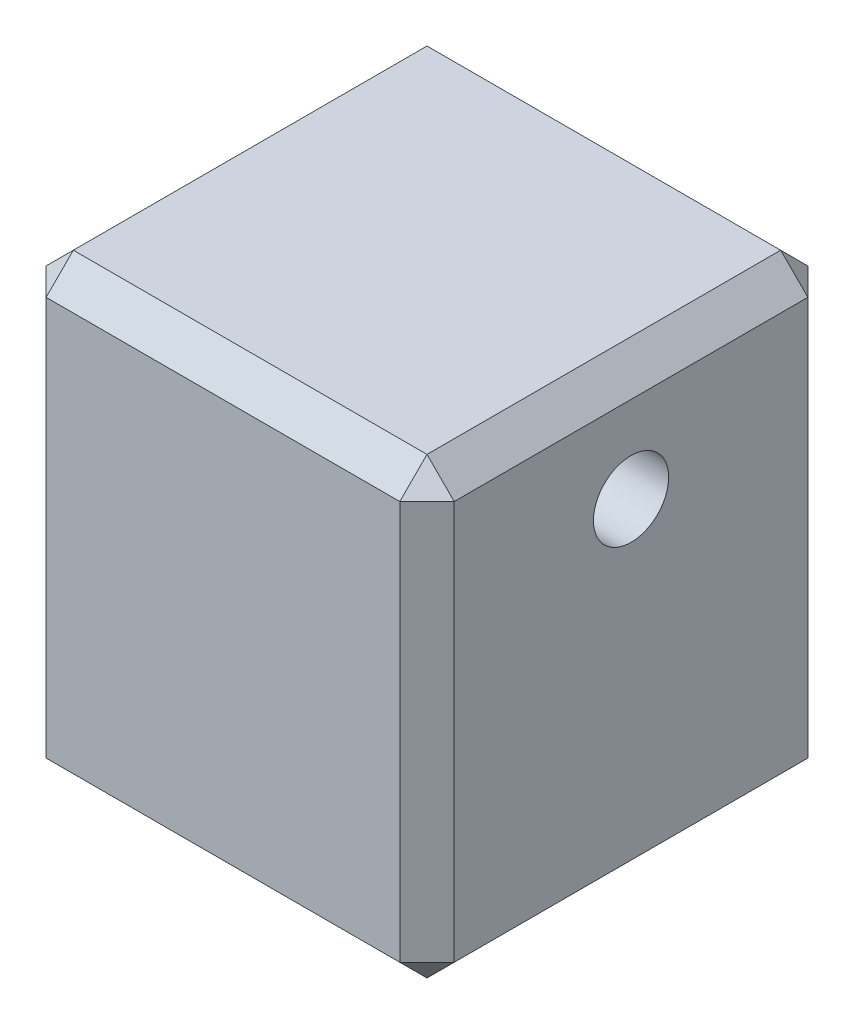
ISO-10303-21;
HEADER;
FILE_DESCRIPTION(('STEP AP214'),'2;1');
FILE_NAME('part.step','',(''),(''),'','','');
FILE_SCHEMA(('AUTOMOTIVE_DESIGN { 1 0 10303 214 1 1 1 1 }'));
ENDSEC;
DATA;
#1=APPLICATION_CONTEXT('core data for automotive mechanical design processes');
#2=APPLICATION_PROTOCOL_DEFINITION('international standard','automotive_design',2000,#1);
#3=PRODUCT_CONTEXT('',#1,'mechanical');
#4=PRODUCT('Part','Part','',(#3));
#5=PRODUCT_RELATED_PRODUCT_CATEGORY('part','',(#4));
#6=PRODUCT_DEFINITION_FORMATION('','',#4);
#7=PRODUCT_DEFINITION_CONTEXT('part definition',#1,'design');
#8=PRODUCT_DEFINITION('design','',#6,#7);
#9=PRODUCT_DEFINITION_SHAPE('','',#8);
#10=(LENGTH_UNIT() NAMED_UNIT(*) SI_UNIT(.MILLI.,.METRE.));
#11=(NAMED_UNIT(*) PLANE_ANGLE_UNIT() SI_UNIT($,.RADIAN.));
#12=(NAMED_UNIT(*) SI_UNIT($,.STERADIAN.) SOLID_ANGLE_UNIT());
#13=UNCERTAINTY_MEASURE_WITH_UNIT(LENGTH_MEASURE(1.E-05),#10,'distance_accuracy_value','');
#14=(GEOMETRIC_REPRESENTATION_CONTEXT(3) GLOBAL_UNCERTAINTY_ASSIGNED_CONTEXT((#13)) GLOBAL_UNIT_ASSIGNED_CONTEXT((#10,
#11,#12)) REPRESENTATION_CONTEXT('',''));
#15=CARTESIAN_POINT('',(0.,0.,0.));
#16=DIRECTION('',(0.,0.,1.));
#17=DIRECTION('',(1.,0.,0.));
#18=AXIS2_PLACEMENT_3D('',#15,#16,#17);
#19=CARTESIAN_POINT('',(22.5,50.,-22.5));
#20=DIRECTION('',(-1.,0.,0.));
#21=DIRECTION('',(0.,0.,1.));
#22=AXIS2_PLACEMENT_3D('',#19,#20,#21);
#23=PLANE('',#22);
#24=DIRECTION('',(0.,-1.,0.));
#25=VECTOR('',#24,1.);
#26=CARTESIAN_POINT('',(22.5,50.,19.5));
#27=LINE('',#26,#25);
#28=CARTESIAN_POINT('',(22.5,47.,19.5));
#29=VERTEX_POINT('',#28);
#30=CARTESIAN_POINT('',(22.5,3.00000000000002,19.5));
#31=VERTEX_POINT('',#30);
#32=EDGE_CURVE('E180',#29,#31,#27,.T.);
#33=ORIENTED_EDGE('',*,*,#32,.T.);
#34=DIRECTION('',(0.,0.,-1.));
#35=VECTOR('',#34,1.);
#36=CARTESIAN_POINT('',(22.5,3.00000000000002,-22.5));
#37=LINE('',#36,#35);
#38=CARTESIAN_POINT('',(22.5,3.00000000000002,-19.5));
#39=VERTEX_POINT('',#38);
#40=EDGE_CURVE('E182',#31,#39,#37,.T.);
#41=ORIENTED_EDGE('',*,*,#40,.T.);
#42=DIRECTION('',(0.,1.,0.));
#43=VECTOR('',#42,1.);
#44=CARTESIAN_POINT('',(22.5,50.,-19.5));
#45=LINE('',#44,#43);
#46=CARTESIAN_POINT('',(22.5,47.,-19.5));
#47=VERTEX_POINT('',#46);
#48=EDGE_CURVE('E176',#39,#47,#45,.T.);
#49=ORIENTED_EDGE('',*,*,#48,.T.);
#50=DIRECTION('',(0.,0.,1.));
#51=VECTOR('',#50,1.);
#52=CARTESIAN_POINT('',(22.5,47.,22.5));
#53=LINE('',#52,#51);
#54=EDGE_CURVE('E178',#47,#29,#53,.T.);
#55=ORIENTED_EDGE('',*,*,#54,.T.);
#56=EDGE_LOOP('',(#33,#41,#49,#55));
#57=FACE_BOUND('',#56,.T.);
#58=CARTESIAN_POINT('',(22.5,37.5,0.));
#59=DIRECTION('',(-1.,0.,0.));
#60=DIRECTION('',(0.,0.,1.));
#61=AXIS2_PLACEMENT_3D('',#58,#59,#60);
#62=CIRCLE('',#61,4.15);
#63=CARTESIAN_POINT('',(22.5,37.5,4.14999999999999));
#64=VERTEX_POINT('',#63);
#65=EDGE_CURVE('E261',#64,#64,#62,.T.);
#66=ORIENTED_EDGE('',*,*,#65,.T.);
#67=EDGE_LOOP('',(#66));
#68=FACE_BOUND('',#67,.T.);
#69=ADVANCED_FACE('F35',(#57,#68),#23,.F.);
#70=CARTESIAN_POINT('',(-22.5,50.,-22.5));
#71=DIRECTION('',(0.,0.,1.));
#72=DIRECTION('',(1.,0.,0.));
#73=AXIS2_PLACEMENT_3D('',#70,#71,#72);
#74=PLANE('',#73);
#75=DIRECTION('',(0.,-1.,0.));
#76=VECTOR('',#75,1.);
#77=CARTESIAN_POINT('',(19.5,50.,-22.5));
#78=LINE('',#77,#76);
#79=CARTESIAN_POINT('',(19.5,47.,-22.5));
#80=VERTEX_POINT('',#79);
#81=CARTESIAN_POINT('',(19.5,3.,-22.5));
#82=VERTEX_POINT('',#81);
#83=EDGE_CURVE('E128',#80,#82,#78,.T.);
#84=ORIENTED_EDGE('',*,*,#83,.T.);
#85=DIRECTION('',(-1.,0.,0.));
#86=VECTOR('',#85,1.);
#87=CARTESIAN_POINT('',(-22.5,3.,-22.5));
#88=LINE('',#87,#86);
#89=CARTESIAN_POINT('',(-19.5,3.,-22.5));
#90=VERTEX_POINT('',#89);
#91=EDGE_CURVE('E165',#82,#90,#88,.T.);
#92=ORIENTED_EDGE('',*,*,#91,.T.);
#93=DIRECTION('',(0.,1.,0.));
#94=VECTOR('',#93,1.);
#95=CARTESIAN_POINT('',(-19.5,50.,-22.5));
#96=LINE('',#95,#94);
#97=CARTESIAN_POINT('',(-19.5,47.,-22.5));
#98=VERTEX_POINT('',#97);
#99=EDGE_CURVE('E131',#90,#98,#96,.T.);
#100=ORIENTED_EDGE('',*,*,#99,.T.);
#101=DIRECTION('',(1.,0.,0.));
#102=VECTOR('',#101,1.);
#103=CARTESIAN_POINT('',(22.5,47.,-22.5));
#104=LINE('',#103,#102);
#105=EDGE_CURVE('E122',#98,#80,#104,.T.);
#106=ORIENTED_EDGE('',*,*,#105,.T.);
#107=EDGE_LOOP('',(#84,#92,#100,#106));
#108=FACE_BOUND('',#107,.T.);
#109=CARTESIAN_POINT('',(0.,12.5,-22.5));
#110=DIRECTION('',(0.,0.,-1.));
#111=DIRECTION('',(-1.,0.,0.));
#112=AXIS2_PLACEMENT_3D('',#109,#110,#111);
#113=CIRCLE('',#112,4.15);
#114=CARTESIAN_POINT('',(-4.15,12.5,-22.5));
#115=VERTEX_POINT('',#114);
#116=EDGE_CURVE('E160',#115,#115,#113,.T.);
#117=ORIENTED_EDGE('',*,*,#116,.F.);
#118=EDGE_LOOP('',(#117));
#119=FACE_BOUND('',#118,.T.);
#120=ADVANCED_FACE('F124',(#108,#119),#74,.F.);
#121=CARTESIAN_POINT('',(-22.5,50.,-22.5));
#122=DIRECTION('',(1.,0.,0.));
#123=DIRECTION('',(0.,0.,-1.));
#124=AXIS2_PLACEMENT_3D('',#121,#122,#123);
#125=PLANE('',#124);
#126=DIRECTION('',(0.,0.,-1.));
#127=VECTOR('',#126,1.);
#128=CARTESIAN_POINT('',(-22.5,47.,-22.5));
#129=LINE('',#128,#127);
#130=CARTESIAN_POINT('',(-22.5,47.,19.5));
#131=VERTEX_POINT('',#130);
#132=CARTESIAN_POINT('',(-22.5,47.,-19.5));
#133=VERTEX_POINT('',#132);
#134=EDGE_CURVE('E194',#131,#133,#129,.T.);
#135=ORIENTED_EDGE('',*,*,#134,.T.);
#136=DIRECTION('',(0.,-1.,0.));
#137=VECTOR('',#136,1.);
#138=CARTESIAN_POINT('',(-22.5,50.,-19.5));
#139=LINE('',#138,#137);
#140=CARTESIAN_POINT('',(-22.5,3.,-19.5));
#141=VERTEX_POINT('',#140);
#142=EDGE_CURVE('E200',#133,#141,#139,.T.);
#143=ORIENTED_EDGE('',*,*,#142,.T.);
#144=DIRECTION('',(0.,0.,1.));
#145=VECTOR('',#144,1.);
#146=CARTESIAN_POINT('',(-22.5,3.,-22.5));
#147=LINE('',#146,#145);
#148=CARTESIAN_POINT('',(-22.5,3.,19.5));
#149=VERTEX_POINT('',#148);
#150=EDGE_CURVE('E198',#141,#149,#147,.T.);
#151=ORIENTED_EDGE('',*,*,#150,.T.);
#152=DIRECTION('',(0.,1.,0.));
#153=VECTOR('',#152,1.);
#154=CARTESIAN_POINT('',(-22.5,50.,19.5));
#155=LINE('',#154,#153);
#156=EDGE_CURVE('E196',#149,#131,#155,.T.);
#157=ORIENTED_EDGE('',*,*,#156,.T.);
#158=EDGE_LOOP('',(#135,#143,#151,#157));
#159=FACE_BOUND('',#158,.T.);
#160=ADVANCED_FACE('F281',(#159),#125,.F.);
#161=CARTESIAN_POINT('',(-22.5,50.,22.5));
#162=DIRECTION('',(0.,0.,-1.));
#163=DIRECTION('',(-1.,0.,0.));
#164=AXIS2_PLACEMENT_3D('',#161,#162,#163);
#165=PLANE('',#164);
#166=DIRECTION('',(1.,0.,0.));
#167=VECTOR('',#166,1.);
#168=CARTESIAN_POINT('',(-22.5,3.,22.5));
#169=LINE('',#168,#167);
#170=CARTESIAN_POINT('',(-19.5,3.,22.5));
#171=VERTEX_POINT('',#170);
#172=CARTESIAN_POINT('',(19.5,3.,22.5));
#173=VERTEX_POINT('',#172);
#174=EDGE_CURVE('E189',#171,#173,#169,.T.);
#175=ORIENTED_EDGE('',*,*,#174,.T.);
#176=DIRECTION('',(0.,1.,0.));
#177=VECTOR('',#176,1.);
#178=CARTESIAN_POINT('',(19.5,50.,22.5));
#179=LINE('',#178,#177);
#180=CARTESIAN_POINT('',(19.5,47.,22.5));
#181=VERTEX_POINT('',#180);
#182=EDGE_CURVE('E191',#173,#181,#179,.T.);
#183=ORIENTED_EDGE('',*,*,#182,.T.);
#184=DIRECTION('',(-1.,0.,0.));
#185=VECTOR('',#184,1.);
#186=CARTESIAN_POINT('',(-22.5,47.,22.5));
#187=LINE('',#186,#185);
#188=CARTESIAN_POINT('',(-19.5,47.,22.5));
#189=VERTEX_POINT('',#188);
#190=EDGE_CURVE('E185',#181,#189,#187,.T.);
#191=ORIENTED_EDGE('',*,*,#190,.T.);
#192=DIRECTION('',(0.,-1.,0.));
#193=VECTOR('',#192,1.);
#194=CARTESIAN_POINT('',(-19.5,50.,22.5));
#195=LINE('',#194,#193);
#196=EDGE_CURVE('E187',#189,#171,#195,.T.);
#197=ORIENTED_EDGE('',*,*,#196,.T.);
#198=EDGE_LOOP('',(#175,#183,#191,#197));
#199=FACE_BOUND('',#198,.T.);
#200=ADVANCED_FACE('F287',(#199),#165,.F.);
#201=CARTESIAN_POINT('',(0.,50.,0.));
#202=DIRECTION('',(0.,1.,0.));
#203=DIRECTION('',(0.,0.,1.));
#204=AXIS2_PLACEMENT_3D('',#201,#202,#203);
#205=PLANE('',#204);
#206=DIRECTION('',(0.,0.,1.));
#207=VECTOR('',#206,1.);
#208=CARTESIAN_POINT('',(-19.5,50.,22.5));
#209=LINE('',#208,#207);
#210=CARTESIAN_POINT('',(-19.5,50.,-19.5));
#211=VERTEX_POINT('',#210);
#212=CARTESIAN_POINT('',(-19.5,50.,19.5));
#213=VERTEX_POINT('',#212);
#214=EDGE_CURVE('E44',#211,#213,#209,.T.);
#215=ORIENTED_EDGE('',*,*,#214,.T.);
#216=DIRECTION('',(1.,0.,0.));
#217=VECTOR('',#216,1.);
#218=CARTESIAN_POINT('',(22.5,50.,19.5));
#219=LINE('',#218,#217);
#220=CARTESIAN_POINT('',(19.5,50.,19.5));
#221=VERTEX_POINT('',#220);
#222=EDGE_CURVE('E11',#213,#221,#219,.T.);
#223=ORIENTED_EDGE('',*,*,#222,.T.);
#224=DIRECTION('',(0.,0.,-1.));
#225=VECTOR('',#224,1.);
#226=CARTESIAN_POINT('',(19.5,50.,-22.5));
#227=LINE('',#226,#225);
#228=CARTESIAN_POINT('',(19.5,50.,-19.5));
#229=VERTEX_POINT('',#228);
#230=EDGE_CURVE('E203',#221,#229,#227,.T.);
#231=ORIENTED_EDGE('',*,*,#230,.T.);
#232=DIRECTION('',(-1.,0.,0.));
#233=VECTOR('',#232,1.);
#234=CARTESIAN_POINT('',(-22.5,50.,-19.5));
#235=LINE('',#234,#233);
#236=EDGE_CURVE('E55',#229,#211,#235,.T.);
#237=ORIENTED_EDGE('',*,*,#236,.T.);
#238=EDGE_LOOP('',(#215,#223,#231,#237));
#239=FACE_BOUND('',#238,.T.);
#240=ADVANCED_FACE('F367',(#239),#205,.T.);
#241=CARTESIAN_POINT('',(0.,0.,0.));
#242=DIRECTION('',(0.,1.,0.));
#243=DIRECTION('',(0.,0.,1.));
#244=AXIS2_PLACEMENT_3D('',#241,#242,#243);
#245=PLANE('',#244);
#246=DIRECTION('',(0.,0.,-1.));
#247=VECTOR('',#246,1.);
#248=CARTESIAN_POINT('',(-19.5,0.,0.));
#249=LINE('',#248,#247);
#250=CARTESIAN_POINT('',(-19.5,0.,19.5));
#251=VERTEX_POINT('',#250);
#252=CARTESIAN_POINT('',(-19.5,0.,-19.5));
#253=VERTEX_POINT('',#252);
#254=EDGE_CURVE('E167',#251,#253,#249,.T.);
#255=ORIENTED_EDGE('',*,*,#254,.T.);
#256=DIRECTION('',(1.,0.,0.));
#257=VECTOR('',#256,1.);
#258=CARTESIAN_POINT('',(0.,0.,-19.5));
#259=LINE('',#258,#257);
#260=CARTESIAN_POINT('',(19.5,0.,-19.5));
#261=VERTEX_POINT('',#260);
#262=EDGE_CURVE('E173',#253,#261,#259,.T.);
#263=ORIENTED_EDGE('',*,*,#262,.T.);
#264=DIRECTION('',(0.,0.,1.));
#265=VECTOR('',#264,1.);
#266=CARTESIAN_POINT('',(19.5,0.,0.));
#267=LINE('',#266,#265);
#268=CARTESIAN_POINT('',(19.5,0.,19.5));
#269=VERTEX_POINT('',#268);
#270=EDGE_CURVE('E171',#261,#269,#267,.T.);
#271=ORIENTED_EDGE('',*,*,#270,.T.);
#272=DIRECTION('',(-1.,0.,0.));
#273=VECTOR('',#272,1.);
#274=CARTESIAN_POINT('',(0.,0.,19.5));
#275=LINE('',#274,#273);
#276=EDGE_CURVE('E169',#269,#251,#275,.T.);
#277=ORIENTED_EDGE('',*,*,#276,.T.);
#278=EDGE_LOOP('',(#255,#263,#271,#277));
#279=FACE_BOUND('',#278,.T.);
#280=ADVANCED_FACE('F394',(#279),#245,.F.);
#281=CARTESIAN_POINT('',(0.,12.5,7.5));
#282=DIRECTION('',(0.,0.,-1.));
#283=DIRECTION('',(-1.,0.,0.));
#284=AXIS2_PLACEMENT_3D('',#281,#282,#283);
#285=CYLINDRICAL_SURFACE('',#284,4.15);
#286=CARTESIAN_POINT('',(0.,12.5,7.5));
#287=DIRECTION('',(0.,0.,-1.));
#288=DIRECTION('',(-1.,0.,0.));
#289=AXIS2_PLACEMENT_3D('',#286,#287,#288);
#290=CIRCLE('',#289,4.15);
#291=CARTESIAN_POINT('',(-4.15,12.5,7.5));
#292=VERTEX_POINT('',#291);
#293=EDGE_CURVE('E157',#292,#292,#290,.T.);
#294=ORIENTED_EDGE('',*,*,#293,.F.);
#295=EDGE_LOOP('',(#294));
#296=FACE_BOUND('',#295,.T.);
#297=ORIENTED_EDGE('',*,*,#116,.T.);
#298=EDGE_LOOP('',(#297));
#299=FACE_BOUND('',#298,.T.);
#300=ADVANCED_FACE('F279',(#296,#299),#285,.F.);
#301=CARTESIAN_POINT('',(0.,12.5,7.5));
#302=DIRECTION('',(0.,0.,-1.));
#303=DIRECTION('',(-1.,0.,0.));
#304=AXIS2_PLACEMENT_3D('',#301,#302,#303);
#305=PLANE('',#304);
#306=ORIENTED_EDGE('',*,*,#293,.T.);
#307=EDGE_LOOP('',(#306));
#308=FACE_BOUND('',#307,.T.);
#309=ADVANCED_FACE('F403',(#308),#305,.T.);
#310=CARTESIAN_POINT('',(-7.49999999999999,37.5,0.));
#311=DIRECTION('',(1.,0.,0.));
#312=DIRECTION('',(0.,0.,-1.));
#313=AXIS2_PLACEMENT_3D('',#310,#311,#312);
#314=CYLINDRICAL_SURFACE('',#313,4.15);
#315=CARTESIAN_POINT('',(-7.49999999999999,37.5,0.));
#316=DIRECTION('',(-1.,0.,0.));
#317=DIRECTION('',(0.,0.,1.));
#318=AXIS2_PLACEMENT_3D('',#315,#316,#317);
#319=CIRCLE('',#318,4.15);
#320=CARTESIAN_POINT('',(-7.49999999999999,37.5,4.15));
#321=VERTEX_POINT('',#320);
#322=EDGE_CURVE('E268',#321,#321,#319,.T.);
#323=ORIENTED_EDGE('',*,*,#322,.T.);
#324=EDGE_LOOP('',(#323));
#325=FACE_BOUND('',#324,.T.);
#326=ORIENTED_EDGE('',*,*,#65,.F.);
#327=EDGE_LOOP('',(#326));
#328=FACE_BOUND('',#327,.T.);
#329=ADVANCED_FACE('F432',(#325,#328),#314,.F.);
#330=CARTESIAN_POINT('',(-7.49999999999999,37.5,0.));
#331=DIRECTION('',(-1.,0.,0.));
#332=DIRECTION('',(0.,0.,1.));
#333=AXIS2_PLACEMENT_3D('',#330,#331,#332);
#334=PLANE('',#333);
#335=ORIENTED_EDGE('',*,*,#322,.F.);
#336=EDGE_LOOP('',(#335));
#337=FACE_BOUND('',#336,.T.);
#338=ADVANCED_FACE('F363',(#337),#334,.F.);
#339=CARTESIAN_POINT('',(0.,50.,19.5));
#340=DIRECTION('',(0.,0.707106781186546,0.707106781186549));
#341=DIRECTION('',(-1.,0.,0.));
#342=AXIS2_PLACEMENT_3D('',#339,#340,#341);
#343=PLANE('',#342);
#344=DIRECTION('',(0.,-0.707106781186549,0.707106781186546));
#345=VECTOR('',#344,1.);
#346=CARTESIAN_POINT('',(19.5,47.,22.5));
#347=LINE('',#346,#345);
#348=EDGE_CURVE('E39',#221,#181,#347,.T.);
#349=ORIENTED_EDGE('',*,*,#348,.F.);
#350=ORIENTED_EDGE('',*,*,#222,.F.);
#351=DIRECTION('',(0.,0.707106781186549,-0.707106781186546));
#352=VECTOR('',#351,1.);
#353=CARTESIAN_POINT('',(-19.5,48.5,21.));
#354=LINE('',#353,#352);
#355=EDGE_CURVE('E254',#189,#213,#354,.T.);
#356=ORIENTED_EDGE('',*,*,#355,.F.);
#357=ORIENTED_EDGE('',*,*,#190,.F.);
#358=EDGE_LOOP('',(#349,#350,#356,#357));
#359=FACE_BOUND('',#358,.T.);
#360=ADVANCED_FACE('F37',(#359),#343,.T.);
#361=CARTESIAN_POINT('',(19.5,47.,22.5));
#362=DIRECTION('',(0.577350269189629,0.577350269189622,0.577350269189626));
#363=DIRECTION('',(0.707106781186546,0.,-0.707106781186549));
#364=AXIS2_PLACEMENT_3D('',#361,#362,#363);
#365=PLANE('',#364);
#366=DIRECTION('',(-0.707106781186546,0.707106781186549,0.));
#367=VECTOR('',#366,1.);
#368=CARTESIAN_POINT('',(21.,48.5,19.5));
#369=LINE('',#368,#367);
#370=EDGE_CURVE('E250',#221,#29,#369,.F.);
#371=ORIENTED_EDGE('',*,*,#370,.F.);
#372=ORIENTED_EDGE('',*,*,#348,.T.);
#373=DIRECTION('',(-0.707106781186546,0.,0.707106781186549));
#374=VECTOR('',#373,1.);
#375=CARTESIAN_POINT('',(19.5,47.,22.5));
#376=LINE('',#375,#374);
#377=EDGE_CURVE('E253',#29,#181,#376,.T.);
#378=ORIENTED_EDGE('',*,*,#377,.F.);
#379=EDGE_LOOP('',(#371,#372,#378));
#380=FACE_BOUND('',#379,.T.);
#381=ADVANCED_FACE('F358',(#380),#365,.T.);
#382=CARTESIAN_POINT('',(-22.5,47.,19.5));
#383=DIRECTION('',(-0.577350269189629,0.577350269189623,0.577350269189625));
#384=DIRECTION('',(0.707106781186545,0.,0.70710678118655));
#385=AXIS2_PLACEMENT_3D('',#382,#383,#384);
#386=PLANE('',#385);
#387=DIRECTION('',(-0.707106781186545,0.,-0.70710678118655));
#388=VECTOR('',#387,1.);
#389=CARTESIAN_POINT('',(-22.5,47.,19.5));
#390=LINE('',#389,#388);
#391=EDGE_CURVE('E244',#189,#131,#390,.T.);
#392=ORIENTED_EDGE('',*,*,#391,.F.);
#393=ORIENTED_EDGE('',*,*,#355,.T.);
#394=DIRECTION('',(-0.707106781186546,-0.707106781186549,0.));
#395=VECTOR('',#394,1.);
#396=CARTESIAN_POINT('',(-22.5,47.,19.5));
#397=LINE('',#396,#395);
#398=EDGE_CURVE('E247',#131,#213,#397,.F.);
#399=ORIENTED_EDGE('',*,*,#398,.F.);
#400=EDGE_LOOP('',(#392,#393,#399));
#401=FACE_BOUND('',#400,.T.);
#402=ADVANCED_FACE('F355',(#401),#386,.T.);
#403=CARTESIAN_POINT('',(22.5,50.,19.5));
#404=DIRECTION('',(-0.707106781186549,0.,-0.707106781186546));
#405=DIRECTION('',(0.,-1.,0.));
#406=AXIS2_PLACEMENT_3D('',#403,#404,#405);
#407=PLANE('',#406);
#408=ORIENTED_EDGE('',*,*,#377,.T.);
#409=ORIENTED_EDGE('',*,*,#182,.F.);
#410=DIRECTION('',(0.707106781186546,0.,-0.707106781186549));
#411=VECTOR('',#410,1.);
#412=CARTESIAN_POINT('',(21.,3.00000000000001,21.));
#413=LINE('',#412,#411);
#414=EDGE_CURVE('E238',#31,#173,#413,.F.);
#415=ORIENTED_EDGE('',*,*,#414,.F.);
#416=ORIENTED_EDGE('',*,*,#32,.F.);
#417=EDGE_LOOP('',(#408,#409,#415,#416));
#418=FACE_BOUND('',#417,.T.);
#419=ADVANCED_FACE('F351',(#418),#407,.F.);
#420=CARTESIAN_POINT('',(19.5,50.,0.));
#421=DIRECTION('',(0.707106781186549,0.707106781186546,0.));
#422=DIRECTION('',(0.,0.,1.));
#423=AXIS2_PLACEMENT_3D('',#420,#421,#422);
#424=PLANE('',#423);
#425=ORIENTED_EDGE('',*,*,#370,.T.);
#426=ORIENTED_EDGE('',*,*,#54,.F.);
#427=DIRECTION('',(0.707106781186546,-0.707106781186549,0.));
#428=VECTOR('',#427,1.);
#429=CARTESIAN_POINT('',(21.,48.5,-19.5));
#430=LINE('',#429,#428);
#431=EDGE_CURVE('E143',#229,#47,#430,.T.);
#432=ORIENTED_EDGE('',*,*,#431,.F.);
#433=ORIENTED_EDGE('',*,*,#230,.F.);
#434=EDGE_LOOP('',(#425,#426,#432,#433));
#435=FACE_BOUND('',#434,.T.);
#436=ADVANCED_FACE('F348',(#435),#424,.T.);
#437=CARTESIAN_POINT('',(0.,50.,-19.5));
#438=DIRECTION('',(0.,0.707106781186549,-0.707106781186546));
#439=DIRECTION('',(1.,0.,0.));
#440=AXIS2_PLACEMENT_3D('',#437,#438,#439);
#441=PLANE('',#440);
#442=DIRECTION('',(0.,-0.707106781186546,-0.707106781186549));
#443=VECTOR('',#442,1.);
#444=CARTESIAN_POINT('',(-19.5,47.,-22.5));
#445=LINE('',#444,#443);
#446=EDGE_CURVE('E144',#211,#98,#445,.T.);
#447=ORIENTED_EDGE('',*,*,#446,.F.);
#448=ORIENTED_EDGE('',*,*,#236,.F.);
#449=DIRECTION('',(0.,0.707106781186546,0.707106781186549));
#450=VECTOR('',#449,1.);
#451=CARTESIAN_POINT('',(19.5,47.,-22.5));
#452=LINE('',#451,#450);
#453=EDGE_CURVE('E137',#80,#229,#452,.T.);
#454=ORIENTED_EDGE('',*,*,#453,.F.);
#455=ORIENTED_EDGE('',*,*,#105,.F.);
#456=EDGE_LOOP('',(#447,#448,#454,#455));
#457=FACE_BOUND('',#456,.T.);
#458=ADVANCED_FACE('F139',(#457),#441,.T.);
#459=CARTESIAN_POINT('',(-19.5,50.,0.));
#460=DIRECTION('',(-0.707106781186549,0.707106781186546,0.));
#461=DIRECTION('',(0.,0.,-1.));
#462=AXIS2_PLACEMENT_3D('',#459,#460,#461);
#463=PLANE('',#462);
#464=ORIENTED_EDGE('',*,*,#398,.T.);
#465=ORIENTED_EDGE('',*,*,#214,.F.);
#466=DIRECTION('',(0.707106781186546,0.707106781186549,0.));
#467=VECTOR('',#466,1.);
#468=CARTESIAN_POINT('',(-21.,48.5,-19.5));
#469=LINE('',#468,#467);
#470=EDGE_CURVE('E233',#133,#211,#469,.T.);
#471=ORIENTED_EDGE('',*,*,#470,.F.);
#472=ORIENTED_EDGE('',*,*,#134,.F.);
#473=EDGE_LOOP('',(#464,#465,#471,#472));
#474=FACE_BOUND('',#473,.T.);
#475=ADVANCED_FACE('F341',(#474),#463,.T.);
#476=CARTESIAN_POINT('',(-19.5,50.,22.5));
#477=DIRECTION('',(0.70710678118655,0.,-0.707106781186545));
#478=DIRECTION('',(0.,-1.,0.));
#479=AXIS2_PLACEMENT_3D('',#476,#477,#478);
#480=PLANE('',#479);
#481=ORIENTED_EDGE('',*,*,#391,.T.);
#482=ORIENTED_EDGE('',*,*,#156,.F.);
#483=DIRECTION('',(0.707106781186545,0.,0.70710678118655));
#484=VECTOR('',#483,1.);
#485=CARTESIAN_POINT('',(-21.,3.,21.));
#486=LINE('',#485,#484);
#487=EDGE_CURVE('E230',#171,#149,#486,.F.);
#488=ORIENTED_EDGE('',*,*,#487,.F.);
#489=ORIENTED_EDGE('',*,*,#196,.F.);
#490=EDGE_LOOP('',(#481,#482,#488,#489));
#491=FACE_BOUND('',#490,.T.);
#492=ADVANCED_FACE('F337',(#491),#480,.F.);
#493=CARTESIAN_POINT('',(-22.5,3.,22.5));
#494=DIRECTION('',(0.,0.707106781186549,-0.707106781186546));
#495=DIRECTION('',(1.,0.,0.));
#496=AXIS2_PLACEMENT_3D('',#493,#494,#495);
#497=PLANE('',#496);
#498=DIRECTION('',(0.,0.707106781186546,0.707106781186549));
#499=VECTOR('',#498,1.);
#500=CARTESIAN_POINT('',(19.5,0.,19.5));
#501=LINE('',#500,#499);
#502=EDGE_CURVE('E241',#173,#269,#501,.F.);
#503=ORIENTED_EDGE('',*,*,#502,.F.);
#504=ORIENTED_EDGE('',*,*,#174,.F.);
#505=DIRECTION('',(0.,-0.707106781186546,-0.707106781186549));
#506=VECTOR('',#505,1.);
#507=CARTESIAN_POINT('',(-19.5,0.,19.5));
#508=LINE('',#507,#506);
#509=EDGE_CURVE('E227',#251,#171,#508,.F.);
#510=ORIENTED_EDGE('',*,*,#509,.F.);
#511=ORIENTED_EDGE('',*,*,#276,.F.);
#512=EDGE_LOOP('',(#503,#504,#510,#511));
#513=FACE_BOUND('',#512,.T.);
#514=ADVANCED_FACE('F333',(#513),#497,.F.);
#515=CARTESIAN_POINT('',(19.5,0.,19.5));
#516=DIRECTION('',(0.577350269189629,-0.577350269189625,0.577350269189624));
#517=DIRECTION('',(0.707106781186545,0.70710678118655,0.));
#518=AXIS2_PLACEMENT_3D('',#515,#516,#517);
#519=PLANE('',#518);
#520=ORIENTED_EDGE('',*,*,#414,.T.);
#521=ORIENTED_EDGE('',*,*,#502,.T.);
#522=DIRECTION('',(-0.707106781186546,-0.707106781186549,0.));
#523=VECTOR('',#522,1.);
#524=CARTESIAN_POINT('',(19.5,0.,19.5));
#525=LINE('',#524,#523);
#526=EDGE_CURVE('E151',#31,#269,#525,.T.);
#527=ORIENTED_EDGE('',*,*,#526,.F.);
#528=EDGE_LOOP('',(#520,#521,#527));
#529=FACE_BOUND('',#528,.T.);
#530=ADVANCED_FACE('F330',(#529),#519,.T.);
#531=CARTESIAN_POINT('',(19.5,47.,-22.5));
#532=DIRECTION('',(0.577350269189628,0.577350269189625,-0.577350269189624));
#533=DIRECTION('',(-0.707106781186546,0.707106781186549,0.));
#534=AXIS2_PLACEMENT_3D('',#531,#532,#533);
#535=PLANE('',#534);
#536=ORIENTED_EDGE('',*,*,#453,.T.);
#537=ORIENTED_EDGE('',*,*,#431,.T.);
#538=DIRECTION('',(0.707106781186547,0.,0.707106781186548));
#539=VECTOR('',#538,1.);
#540=CARTESIAN_POINT('',(19.5,47.,-22.5));
#541=LINE('',#540,#539);
#542=EDGE_CURVE('E147',#80,#47,#541,.T.);
#543=ORIENTED_EDGE('',*,*,#542,.F.);
#544=EDGE_LOOP('',(#536,#537,#543));
#545=FACE_BOUND('',#544,.T.);
#546=ADVANCED_FACE('F148',(#545),#535,.T.);
#547=CARTESIAN_POINT('',(-19.5,47.,-22.5));
#548=DIRECTION('',(-0.577350269189629,0.577350269189626,-0.577350269189623));
#549=DIRECTION('',(-0.707106781186546,-0.707106781186549,0.));
#550=AXIS2_PLACEMENT_3D('',#547,#548,#549);
#551=PLANE('',#550);
#552=ORIENTED_EDGE('',*,*,#470,.T.);
#553=ORIENTED_EDGE('',*,*,#446,.T.);
#554=DIRECTION('',(0.707106781186546,0.,-0.707106781186549));
#555=VECTOR('',#554,1.);
#556=CARTESIAN_POINT('',(-19.5,47.,-22.5));
#557=LINE('',#556,#555);
#558=EDGE_CURVE('E152',#133,#98,#557,.T.);
#559=ORIENTED_EDGE('',*,*,#558,.F.);
#560=EDGE_LOOP('',(#552,#553,#559));
#561=FACE_BOUND('',#560,.T.);
#562=ADVANCED_FACE('F323',(#561),#551,.T.);
#563=CARTESIAN_POINT('',(-19.5,0.,19.5));
#564=DIRECTION('',(-0.577350269189627,-0.577350269189628,0.577350269189623));
#565=DIRECTION('',(0.707106781186548,-0.707106781186547,0.));
#566=AXIS2_PLACEMENT_3D('',#563,#564,#565);
#567=PLANE('',#566);
#568=ORIENTED_EDGE('',*,*,#509,.T.);
#569=ORIENTED_EDGE('',*,*,#487,.T.);
#570=DIRECTION('',(-0.707106781186549,0.707106781186546,0.));
#571=VECTOR('',#570,1.);
#572=CARTESIAN_POINT('',(-19.5,0.,19.5));
#573=LINE('',#572,#571);
#574=EDGE_CURVE('E220',#251,#149,#573,.T.);
#575=ORIENTED_EDGE('',*,*,#574,.F.);
#576=EDGE_LOOP('',(#568,#569,#575));
#577=FACE_BOUND('',#576,.T.);
#578=ADVANCED_FACE('F319',(#577),#567,.T.);
#579=CARTESIAN_POINT('',(22.5,3.00000000000002,-22.5));
#580=DIRECTION('',(-0.707106781186549,0.707106781186546,0.));
#581=DIRECTION('',(0.,0.,-1.));
#582=AXIS2_PLACEMENT_3D('',#579,#580,#581);
#583=PLANE('',#582);
#584=ORIENTED_EDGE('',*,*,#526,.T.);
#585=ORIENTED_EDGE('',*,*,#270,.F.);
#586=DIRECTION('',(0.707106781186546,0.707106781186549,0.));
#587=VECTOR('',#586,1.);
#588=CARTESIAN_POINT('',(19.5,0.,-19.5));
#589=LINE('',#588,#587);
#590=EDGE_CURVE('E217',#39,#261,#589,.F.);
#591=ORIENTED_EDGE('',*,*,#590,.F.);
#592=ORIENTED_EDGE('',*,*,#40,.F.);
#593=EDGE_LOOP('',(#584,#585,#591,#592));
#594=FACE_BOUND('',#593,.T.);
#595=ADVANCED_FACE('F316',(#594),#583,.F.);
#596=CARTESIAN_POINT('',(19.5,50.,-22.5));
#597=DIRECTION('',(-0.707106781186548,0.,0.707106781186547));
#598=DIRECTION('',(0.,-1.,0.));
#599=AXIS2_PLACEMENT_3D('',#596,#597,#598);
#600=PLANE('',#599);
#601=ORIENTED_EDGE('',*,*,#542,.T.);
#602=ORIENTED_EDGE('',*,*,#48,.F.);
#603=DIRECTION('',(-0.707106781186547,0.,-0.707106781186548));
#604=VECTOR('',#603,1.);
#605=CARTESIAN_POINT('',(21.,3.00000000000001,-21.));
#606=LINE('',#605,#604);
#607=EDGE_CURVE('E155',#82,#39,#606,.F.);
#608=ORIENTED_EDGE('',*,*,#607,.F.);
#609=ORIENTED_EDGE('',*,*,#83,.F.);
#610=EDGE_LOOP('',(#601,#602,#608,#609));
#611=FACE_BOUND('',#610,.T.);
#612=ADVANCED_FACE('F154',(#611),#600,.F.);
#613=CARTESIAN_POINT('',(-22.5,50.,-19.5));
#614=DIRECTION('',(0.707106781186549,0.,0.707106781186546));
#615=DIRECTION('',(0.,-1.,0.));
#616=AXIS2_PLACEMENT_3D('',#613,#614,#615);
#617=PLANE('',#616);
#618=ORIENTED_EDGE('',*,*,#558,.T.);
#619=ORIENTED_EDGE('',*,*,#99,.F.);
#620=DIRECTION('',(-0.707106781186546,0.,0.707106781186549));
#621=VECTOR('',#620,1.);
#622=CARTESIAN_POINT('',(-19.5,3.,-22.5));
#623=LINE('',#622,#621);
#624=EDGE_CURVE('E213',#141,#90,#623,.F.);
#625=ORIENTED_EDGE('',*,*,#624,.F.);
#626=ORIENTED_EDGE('',*,*,#142,.F.);
#627=EDGE_LOOP('',(#618,#619,#625,#626));
#628=FACE_BOUND('',#627,.T.);
#629=ADVANCED_FACE('F309',(#628),#617,.F.);
#630=CARTESIAN_POINT('',(-22.5,3.,-22.5));
#631=DIRECTION('',(0.707106781186546,0.707106781186549,0.));
#632=DIRECTION('',(0.,0.,1.));
#633=AXIS2_PLACEMENT_3D('',#630,#631,#632);
#634=PLANE('',#633);
#635=ORIENTED_EDGE('',*,*,#574,.T.);
#636=ORIENTED_EDGE('',*,*,#150,.F.);
#637=DIRECTION('',(0.707106781186549,-0.707106781186546,0.));
#638=VECTOR('',#637,1.);
#639=CARTESIAN_POINT('',(-21.,1.5,-19.5));
#640=LINE('',#639,#638);
#641=EDGE_CURVE('E211',#253,#141,#640,.F.);
#642=ORIENTED_EDGE('',*,*,#641,.F.);
#643=ORIENTED_EDGE('',*,*,#254,.F.);
#644=EDGE_LOOP('',(#635,#636,#642,#643));
#645=FACE_BOUND('',#644,.T.);
#646=ADVANCED_FACE('F305',(#645),#634,.F.);
#647=CARTESIAN_POINT('',(19.5,0.,-19.5));
#648=DIRECTION('',(0.577350269189628,-0.577350269189625,-0.577350269189624));
#649=DIRECTION('',(0.707106781186546,0.707106781186549,0.));
#650=AXIS2_PLACEMENT_3D('',#647,#648,#649);
#651=PLANE('',#650);
#652=ORIENTED_EDGE('',*,*,#607,.T.);
#653=ORIENTED_EDGE('',*,*,#590,.T.);
#654=DIRECTION('',(0.,-0.707106781186546,0.707106781186549));
#655=VECTOR('',#654,1.);
#656=CARTESIAN_POINT('',(19.5,0.,-19.5));
#657=LINE('',#656,#655);
#658=EDGE_CURVE('E209',#82,#261,#657,.T.);
#659=ORIENTED_EDGE('',*,*,#658,.F.);
#660=EDGE_LOOP('',(#652,#653,#659));
#661=FACE_BOUND('',#660,.T.);
#662=ADVANCED_FACE('F301',(#661),#651,.T.);
#663=CARTESIAN_POINT('',(-19.5,3.,-22.5));
#664=DIRECTION('',(-0.577350269189626,-0.577350269189629,-0.577350269189623));
#665=DIRECTION('',(0.707106781186549,-0.707106781186546,0.));
#666=AXIS2_PLACEMENT_3D('',#663,#664,#665);
#667=PLANE('',#666);
#668=ORIENTED_EDGE('',*,*,#641,.T.);
#669=ORIENTED_EDGE('',*,*,#624,.T.);
#670=DIRECTION('',(0.,0.707106781186546,-0.707106781186549));
#671=VECTOR('',#670,1.);
#672=CARTESIAN_POINT('',(-19.5,3.,-22.5));
#673=LINE('',#672,#671);
#674=EDGE_CURVE('E207',#253,#90,#673,.T.);
#675=ORIENTED_EDGE('',*,*,#674,.F.);
#676=EDGE_LOOP('',(#668,#669,#675));
#677=FACE_BOUND('',#676,.T.);
#678=ADVANCED_FACE('F297',(#677),#667,.T.);
#679=CARTESIAN_POINT('',(-22.5,3.,-22.5));
#680=DIRECTION('',(0.,0.707106781186549,0.707106781186546));
#681=DIRECTION('',(-1.,0.,0.));
#682=AXIS2_PLACEMENT_3D('',#679,#680,#681);
#683=PLANE('',#682);
#684=ORIENTED_EDGE('',*,*,#658,.T.);
#685=ORIENTED_EDGE('',*,*,#262,.F.);
#686=ORIENTED_EDGE('',*,*,#674,.T.);
#687=ORIENTED_EDGE('',*,*,#91,.F.);
#688=EDGE_LOOP('',(#684,#685,#686,#687));
#689=FACE_BOUND('',#688,.T.);
#690=ADVANCED_FACE('F294',(#689),#683,.F.);
#691=CLOSED_SHELL('',(#69,#120,#160,#200,#240,#280,#300,#309,#329,#338,#360,#381,#402,#419,#436,
#458,#475,#492,#514,#530,#546,#562,#578,#595,#612,#629,#646,#662,#678,#690));
#692=MANIFOLD_SOLID_BREP('B2',#691);
#693=ADVANCED_BREP_SHAPE_REPRESENTATION('',(#18,#692),#14);
#694=SHAPE_DEFINITION_REPRESENTATION(#9,#693);
ENDSEC;
END-ISO-10303-21;
